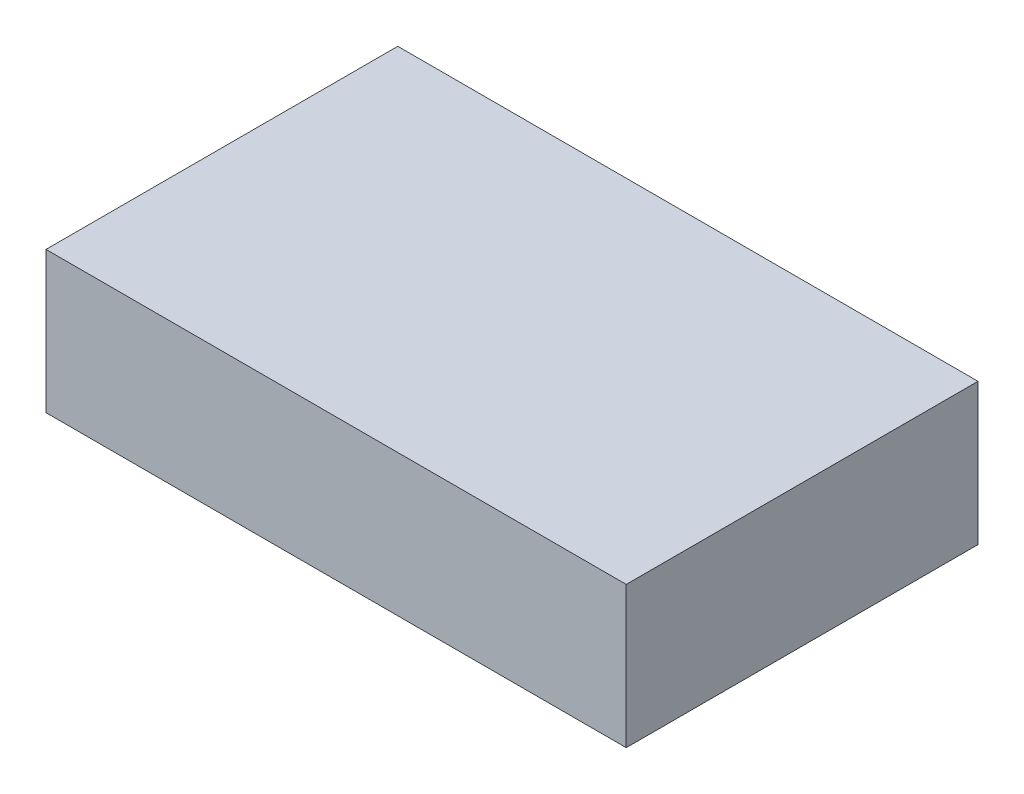
ISO-10303-21;
HEADER;
FILE_DESCRIPTION(('STEP AP214'),'2;1');
FILE_NAME('part.step','',(''),(''),'','','');
FILE_SCHEMA(('AUTOMOTIVE_DESIGN { 1 0 10303 214 1 1 1 1 }'));
ENDSEC;
DATA;
#1=APPLICATION_CONTEXT('core data for automotive mechanical design processes');
#2=APPLICATION_PROTOCOL_DEFINITION('international standard','automotive_design',2000,#1);
#3=PRODUCT_CONTEXT('',#1,'mechanical');
#4=PRODUCT('Part','Part','',(#3));
#5=PRODUCT_RELATED_PRODUCT_CATEGORY('part','',(#4));
#6=PRODUCT_DEFINITION_FORMATION('','',#4);
#7=PRODUCT_DEFINITION_CONTEXT('part definition',#1,'design');
#8=PRODUCT_DEFINITION('design','',#6,#7);
#9=PRODUCT_DEFINITION_SHAPE('','',#8);
#10=(LENGTH_UNIT() NAMED_UNIT(*) SI_UNIT(.MILLI.,.METRE.));
#11=(NAMED_UNIT(*) PLANE_ANGLE_UNIT() SI_UNIT($,.RADIAN.));
#12=(NAMED_UNIT(*) SI_UNIT($,.STERADIAN.) SOLID_ANGLE_UNIT());
#13=UNCERTAINTY_MEASURE_WITH_UNIT(LENGTH_MEASURE(1.E-05),#10,'distance_accuracy_value','');
#14=(GEOMETRIC_REPRESENTATION_CONTEXT(3) GLOBAL_UNCERTAINTY_ASSIGNED_CONTEXT((#13)) GLOBAL_UNIT_ASSIGNED_CONTEXT((#10,
#11,#12)) REPRESENTATION_CONTEXT('',''));
#15=CARTESIAN_POINT('',(0.,0.,0.));
#16=DIRECTION('',(0.,0.,1.));
#17=DIRECTION('',(1.,0.,0.));
#18=AXIS2_PLACEMENT_3D('',#15,#16,#17);
#19=CARTESIAN_POINT('',(80.,39.,48.5));
#20=DIRECTION('',(-1.,0.,0.));
#21=DIRECTION('',(0.,0.,1.));
#22=AXIS2_PLACEMENT_3D('',#19,#20,#21);
#23=PLANE('',#22);
#24=DIRECTION('',(0.,0.,-1.));
#25=VECTOR('',#24,1.);
#26=CARTESIAN_POINT('',(80.,0.,48.5));
#27=LINE('',#26,#25);
#28=CARTESIAN_POINT('',(80.,0.,48.5));
#29=VERTEX_POINT('',#28);
#30=CARTESIAN_POINT('',(80.,0.,-48.5));
#31=VERTEX_POINT('',#30);
#32=EDGE_CURVE('E100',#29,#31,#27,.T.);
#33=ORIENTED_EDGE('',*,*,#32,.T.);
#34=DIRECTION('',(0.,-1.,0.));
#35=VECTOR('',#34,1.);
#36=CARTESIAN_POINT('',(80.,39.,-48.5));
#37=LINE('',#36,#35);
#38=CARTESIAN_POINT('',(80.,39.,-48.5));
#39=VERTEX_POINT('',#38);
#40=EDGE_CURVE('E11',#39,#31,#37,.T.);
#41=ORIENTED_EDGE('',*,*,#40,.F.);
#42=DIRECTION('',(0.,0.,-1.));
#43=VECTOR('',#42,1.);
#44=CARTESIAN_POINT('',(80.,39.,48.5));
#45=LINE('',#44,#43);
#46=CARTESIAN_POINT('',(80.,39.,48.5));
#47=VERTEX_POINT('',#46);
#48=EDGE_CURVE('E88',#47,#39,#45,.T.);
#49=ORIENTED_EDGE('',*,*,#48,.F.);
#50=DIRECTION('',(0.,-1.,0.));
#51=VECTOR('',#50,1.);
#52=CARTESIAN_POINT('',(80.,39.,48.5));
#53=LINE('',#52,#51);
#54=EDGE_CURVE('E96',#47,#29,#53,.T.);
#55=ORIENTED_EDGE('',*,*,#54,.T.);
#56=EDGE_LOOP('',(#33,#41,#49,#55));
#57=FACE_BOUND('',#56,.T.);
#58=ADVANCED_FACE('F37',(#57),#23,.F.);
#59=CARTESIAN_POINT('',(-80.,39.,-48.5));
#60=DIRECTION('',(0.,0.,1.));
#61=DIRECTION('',(1.,0.,0.));
#62=AXIS2_PLACEMENT_3D('',#59,#60,#61);
#63=PLANE('',#62);
#64=DIRECTION('',(-1.,0.,0.));
#65=VECTOR('',#64,1.);
#66=CARTESIAN_POINT('',(-80.,0.,-48.5));
#67=LINE('',#66,#65);
#68=CARTESIAN_POINT('',(-80.,0.,-48.5));
#69=VERTEX_POINT('',#68);
#70=EDGE_CURVE('E92',#31,#69,#67,.T.);
#71=ORIENTED_EDGE('',*,*,#70,.T.);
#72=DIRECTION('',(0.,-1.,0.));
#73=VECTOR('',#72,1.);
#74=CARTESIAN_POINT('',(-80.,39.,-48.5));
#75=LINE('',#74,#73);
#76=CARTESIAN_POINT('',(-80.,39.,-48.5));
#77=VERTEX_POINT('',#76);
#78=EDGE_CURVE('E45',#77,#69,#75,.T.);
#79=ORIENTED_EDGE('',*,*,#78,.F.);
#80=DIRECTION('',(-1.,0.,0.));
#81=VECTOR('',#80,1.);
#82=CARTESIAN_POINT('',(-80.,39.,-48.5));
#83=LINE('',#82,#81);
#84=EDGE_CURVE('E83',#39,#77,#83,.T.);
#85=ORIENTED_EDGE('',*,*,#84,.F.);
#86=ORIENTED_EDGE('',*,*,#40,.T.);
#87=EDGE_LOOP('',(#71,#79,#85,#86));
#88=FACE_BOUND('',#87,.T.);
#89=ADVANCED_FACE('F91',(#88),#63,.F.);
#90=CARTESIAN_POINT('',(-80.,39.,48.5));
#91=DIRECTION('',(1.,0.,0.));
#92=DIRECTION('',(0.,0.,-1.));
#93=AXIS2_PLACEMENT_3D('',#90,#91,#92);
#94=PLANE('',#93);
#95=DIRECTION('',(0.,0.,1.));
#96=VECTOR('',#95,1.);
#97=CARTESIAN_POINT('',(-80.,0.,48.5));
#98=LINE('',#97,#96);
#99=CARTESIAN_POINT('',(-80.,0.,48.5));
#100=VERTEX_POINT('',#99);
#101=EDGE_CURVE('E70',#69,#100,#98,.T.);
#102=ORIENTED_EDGE('',*,*,#101,.T.);
#103=DIRECTION('',(0.,-1.,0.));
#104=VECTOR('',#103,1.);
#105=CARTESIAN_POINT('',(-80.,39.,48.5));
#106=LINE('',#105,#104);
#107=CARTESIAN_POINT('',(-80.,39.,48.5));
#108=VERTEX_POINT('',#107);
#109=EDGE_CURVE('E93',#108,#100,#106,.T.);
#110=ORIENTED_EDGE('',*,*,#109,.F.);
#111=DIRECTION('',(0.,0.,1.));
#112=VECTOR('',#111,1.);
#113=CARTESIAN_POINT('',(-80.,39.,48.5));
#114=LINE('',#113,#112);
#115=EDGE_CURVE('E86',#77,#108,#114,.T.);
#116=ORIENTED_EDGE('',*,*,#115,.F.);
#117=ORIENTED_EDGE('',*,*,#78,.T.);
#118=EDGE_LOOP('',(#102,#110,#116,#117));
#119=FACE_BOUND('',#118,.T.);
#120=ADVANCED_FACE('F94',(#119),#94,.F.);
#121=CARTESIAN_POINT('',(-80.,39.,48.5));
#122=DIRECTION('',(0.,0.,-1.));
#123=DIRECTION('',(-1.,0.,0.));
#124=AXIS2_PLACEMENT_3D('',#121,#122,#123);
#125=PLANE('',#124);
#126=DIRECTION('',(1.,0.,0.));
#127=VECTOR('',#126,1.);
#128=CARTESIAN_POINT('',(-80.,0.,48.5));
#129=LINE('',#128,#127);
#130=EDGE_CURVE('E76',#100,#29,#129,.T.);
#131=ORIENTED_EDGE('',*,*,#130,.T.);
#132=ORIENTED_EDGE('',*,*,#54,.F.);
#133=DIRECTION('',(1.,0.,0.));
#134=VECTOR('',#133,1.);
#135=CARTESIAN_POINT('',(-80.,39.,48.5));
#136=LINE('',#135,#134);
#137=EDGE_CURVE('E53',#108,#47,#136,.T.);
#138=ORIENTED_EDGE('',*,*,#137,.F.);
#139=ORIENTED_EDGE('',*,*,#109,.T.);
#140=EDGE_LOOP('',(#131,#132,#138,#139));
#141=FACE_BOUND('',#140,.T.);
#142=ADVANCED_FACE('F107',(#141),#125,.F.);
#143=CARTESIAN_POINT('',(0.,39.,0.));
#144=DIRECTION('',(0.,-1.,0.));
#145=DIRECTION('',(0.,0.,-1.));
#146=AXIS2_PLACEMENT_3D('',#143,#144,#145);
#147=PLANE('',#146);
#148=ORIENTED_EDGE('',*,*,#48,.T.);
#149=ORIENTED_EDGE('',*,*,#84,.T.);
#150=ORIENTED_EDGE('',*,*,#115,.T.);
#151=ORIENTED_EDGE('',*,*,#137,.T.);
#152=EDGE_LOOP('',(#148,#149,#150,#151));
#153=FACE_BOUND('',#152,.T.);
#154=ADVANCED_FACE('F84',(#153),#147,.F.);
#155=CARTESIAN_POINT('',(0.,0.,0.));
#156=DIRECTION('',(0.,-1.,0.));
#157=DIRECTION('',(0.,0.,-1.));
#158=AXIS2_PLACEMENT_3D('',#155,#156,#157);
#159=PLANE('',#158);
#160=ORIENTED_EDGE('',*,*,#32,.F.);
#161=ORIENTED_EDGE('',*,*,#130,.F.);
#162=ORIENTED_EDGE('',*,*,#101,.F.);
#163=ORIENTED_EDGE('',*,*,#70,.F.);
#164=EDGE_LOOP('',(#160,#161,#162,#163));
#165=FACE_BOUND('',#164,.T.);
#166=ADVANCED_FACE('F110',(#165),#159,.T.);
#167=CLOSED_SHELL('',(#58,#89,#120,#142,#154,#166));
#168=MANIFOLD_SOLID_BREP('B2',#167);
#169=ADVANCED_BREP_SHAPE_REPRESENTATION('',(#18,#168),#14);
#170=SHAPE_DEFINITION_REPRESENTATION(#9,#169);
ENDSEC;
END-ISO-10303-21;
